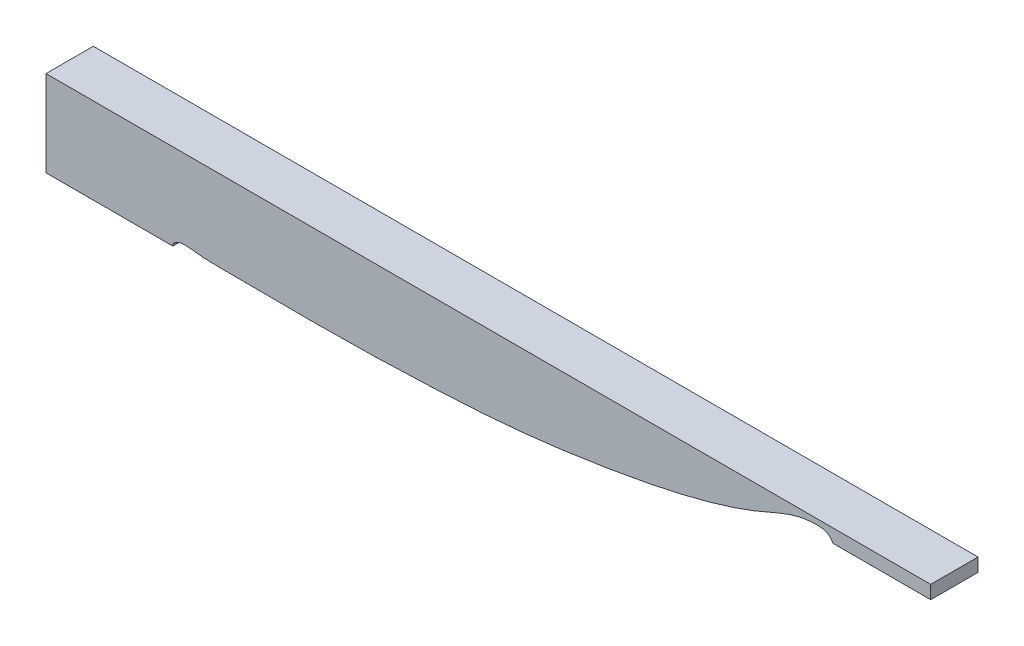
ISO-10303-21;
HEADER;
FILE_DESCRIPTION(('STEP AP214'),'2;1');
FILE_NAME('part.step','',(''),(''),'','','');
FILE_SCHEMA(('AUTOMOTIVE_DESIGN { 1 0 10303 214 1 1 1 1 }'));
ENDSEC;
DATA;
#1=APPLICATION_CONTEXT('core data for automotive mechanical design processes');
#2=APPLICATION_PROTOCOL_DEFINITION('international standard','automotive_design',2000,#1);
#3=PRODUCT_CONTEXT('',#1,'mechanical');
#4=PRODUCT('Part','Part','',(#3));
#5=PRODUCT_RELATED_PRODUCT_CATEGORY('part','',(#4));
#6=PRODUCT_DEFINITION_FORMATION('','',#4);
#7=PRODUCT_DEFINITION_CONTEXT('part definition',#1,'design');
#8=PRODUCT_DEFINITION('design','',#6,#7);
#9=PRODUCT_DEFINITION_SHAPE('','',#8);
#10=(LENGTH_UNIT() NAMED_UNIT(*) SI_UNIT(.MILLI.,.METRE.));
#11=(NAMED_UNIT(*) PLANE_ANGLE_UNIT() SI_UNIT($,.RADIAN.));
#12=(NAMED_UNIT(*) SI_UNIT($,.STERADIAN.) SOLID_ANGLE_UNIT());
#13=UNCERTAINTY_MEASURE_WITH_UNIT(LENGTH_MEASURE(1.E-05),#10,'distance_accuracy_value','');
#14=(GEOMETRIC_REPRESENTATION_CONTEXT(3) GLOBAL_UNCERTAINTY_ASSIGNED_CONTEXT((#13)) GLOBAL_UNIT_ASSIGNED_CONTEXT((#10,
#11,#12)) REPRESENTATION_CONTEXT('',''));
#15=CARTESIAN_POINT('',(0.,0.,0.));
#16=DIRECTION('',(0.,0.,1.));
#17=DIRECTION('',(1.,0.,0.));
#18=AXIS2_PLACEMENT_3D('',#15,#16,#17);
#19=CARTESIAN_POINT('',(-62.7052484087813,-12.2840293904148,452.));
#20=CARTESIAN_POINT('',(-62.7121738590316,-12.2096303217744,452.));
#21=CARTESIAN_POINT('',(-62.7180514623524,-12.134164171952,452.));
#22=CARTESIAN_POINT('',(-62.699155143721,-11.9850711025203,452.));
#23=CARTESIAN_POINT('',(-62.6742630979262,-11.9122310487829,452.));
#24=CARTESIAN_POINT('',(-62.5955876394054,-11.7852802616555,452.));
#25=CARTESIAN_POINT('',(-62.5393164774228,-11.7328335104575,452.));
#26=CARTESIAN_POINT('',(-62.4175833187329,-11.645073332359,452.));
#27=CARTESIAN_POINT('',(-62.3536428521394,-11.6049816391227,452.));
#28=CARTESIAN_POINT('',(-62.1636796681233,-11.4831247408542,452.));
#29=CARTESIAN_POINT('',(-62.0331228803665,-11.4072944019221,452.));
#30=CARTESIAN_POINT('',(-61.7632257846357,-11.2765245294321,452.));
#31=CARTESIAN_POINT('',(-61.6213141505206,-11.2232252966794,452.));
#32=CARTESIAN_POINT('',(-61.1856297690964,-11.1129358942114,452.));
#33=CARTESIAN_POINT('',(-60.8905922439576,-11.0972740294809,452.));
#34=CARTESIAN_POINT('',(-60.297250650261,-11.1072088487196,452.));
#35=CARTESIAN_POINT('',(-59.999439103481,-11.1326509879397,452.));
#36=CARTESIAN_POINT('',(-59.407480124833,-11.1971270396552,452.));
#37=CARTESIAN_POINT('',(-59.1121988801194,-11.2363530762913,452.));
#38=CARTESIAN_POINT('',(-58.5204096285446,-11.3025277513826,452.));
#39=CARTESIAN_POINT('',(-58.2239689937358,-11.3301506472831,452.));
#40=CARTESIAN_POINT('',(-57.3332517410831,-11.3990547324693,452.));
#41=CARTESIAN_POINT('',(-56.7388339925977,-11.4256387706635,452.));
#42=CARTESIAN_POINT('',(-55.5497412734209,-11.4561396280096,452.));
#43=CARTESIAN_POINT('',(-54.9550206700727,-11.4628491862308,452.));
#44=CARTESIAN_POINT('',(-53.765569067012,-11.47575870622,452.));
#45=CARTESIAN_POINT('',(-53.1708478344687,-11.4824374233119,452.));
#46=CARTESIAN_POINT('',(-51.3866148993883,-11.4990797767451,452.));
#47=CARTESIAN_POINT('',(-50.1970311958799,-11.505735180364,452.));
#48=CARTESIAN_POINT('',(-46.6283315797209,-11.5240833752778,452.));
#49=CARTESIAN_POINT('',(-44.2491742097644,-11.5328653690821,452.));
#50=CARTESIAN_POINT('',(-39.4908495052337,-11.5367494061676,452.));
#51=CARTESIAN_POINT('',(-37.1116877219363,-11.5297156373008,452.));
#52=CARTESIAN_POINT('',(-32.3537154297238,-11.4772555912144,452.));
#53=CARTESIAN_POINT('',(-29.9749126769411,-11.4330188772853,452.));
#54=CARTESIAN_POINT('',(-25.2188871638521,-11.3031881700815,452.));
#55=CARTESIAN_POINT('',(-22.8415086655277,-11.2180343466114,452.));
#56=CARTESIAN_POINT('',(-18.0876675883811,-11.0185007335615,452.));
#57=CARTESIAN_POINT('',(-15.7112451034112,-10.9029825213608,452.));
#58=CARTESIAN_POINT('',(-10.9621356269786,-10.6234025116616,452.));
#59=CARTESIAN_POINT('',(-8.58935175775453,-10.4577567002171,452.));
#60=CARTESIAN_POINT('',(-3.84950926087558,-10.0428729316787,452.));
#61=CARTESIAN_POINT('',(-1.48262718248254,-9.79290226620141,452.));
#62=CARTESIAN_POINT('',(3.23810622948647,-9.20853810090821,452.));
#63=CARTESIAN_POINT('',(5.59327830851287,-8.87736682813762,452.));
#64=CARTESIAN_POINT('',(10.2955973372614,-8.15479025718168,452.));
#65=CARTESIAN_POINT('',(12.6428112063497,-7.76312125925916,452.));
#66=CARTESIAN_POINT('',(17.3230454894747,-6.90573778166401,452.));
#67=CARTESIAN_POINT('',(19.6571732150893,-6.44213138906897,452.));
#68=CARTESIAN_POINT('',(23.139396543935,-5.6632435976321,452.));
#69=CARTESIAN_POINT('',(24.2975429745054,-5.38869095537908,452.));
#70=CARTESIAN_POINT('',(26.6020790891636,-4.80154569492244,452.));
#71=CARTESIAN_POINT('',(27.7478909570069,-4.48848341746983,452.));
#72=CARTESIAN_POINT('',(31.1668493131534,-3.49351832241277,452.));
#73=CARTESIAN_POINT('',(33.4237405593667,-2.762544929267,452.));
#74=CARTESIAN_POINT('',(36.1848610801607,-1.66772246380116,452.));
#75=CARTESIAN_POINT('',(36.734137794449,-1.43986052602558,452.));
#76=CARTESIAN_POINT('',(37.829418084322,-0.974255850230333,452.));
#77=CARTESIAN_POINT('',(38.3749180741802,-0.734971473130707,452.));
#78=CARTESIAN_POINT('',(40.014283241704,-0.025918390729653,452.));
#79=CARTESIAN_POINT('',(41.1119333530073,0.432109591118433,452.));
#80=CARTESIAN_POINT('',(42.8198911289569,0.928813933071767,452.));
#81=CARTESIAN_POINT('',(43.3998454899815,1.06145793692773,452.));
#82=CARTESIAN_POINT('',(44.5815780106277,1.25918391062123,452.));
#83=CARTESIAN_POINT('',(45.1823164747849,1.32549328918058,452.));
#84=CARTESIAN_POINT('',(46.0795814668789,1.35833804015265,452.));
#85=CARTESIAN_POINT('',(46.3788638651951,1.35855045926507,452.));
#86=CARTESIAN_POINT('',(46.8283960941802,1.32519955959442,452.));
#87=CARTESIAN_POINT('',(46.9783372345549,1.30871300470868,452.));
#88=CARTESIAN_POINT('',(47.2784604887634,1.26240923004741,452.));
#89=CARTESIAN_POINT('',(47.426687102723,1.23229191641705,452.));
#90=CARTESIAN_POINT('',(47.7159595327065,1.14737796162339,452.));
#91=CARTESIAN_POINT('',(47.8592174930012,1.09090343219004,452.));
#92=CARTESIAN_POINT('',(48.1205666503784,0.93828347895032,452.));
#93=CARTESIAN_POINT('',(48.2353877427949,0.840295544021604,452.));
#94=CARTESIAN_POINT('',(48.4471040786393,0.621035341205771,452.));
#95=CARTESIAN_POINT('',(48.5410776992265,0.501535423135573,452.));
#96=CARTESIAN_POINT('',(48.6879173212099,0.327168065883125,452.));
#97=CARTESIAN_POINT('',(48.7371148095842,0.269254019208788,452.));
#98=CARTESIAN_POINT('',(48.8242175901574,0.144048041888548,452.));
#99=CARTESIAN_POINT('',(48.8596456390957,0.0758553950526798,452.));
#100=CARTESIAN_POINT('',(48.8731439710612,1.12228477379406E-13,452.));
#101=B_SPLINE_CURVE_WITH_KNOTS('',3,(#19,#20,#21,#22,#23,#24,#25,#26,#27,#28,#29,#30,#31,#32,
#33,#34,#35,#36,#37,#38,#39,#40,#41,#42,#43,#44,#45,#46,#47,#48,#49,#50,#51,#52,#53,#54,#55,#56,
#57,#58,#59,#60,#61,#62,#63,#64,#65,#66,#67,#68,#69,#70,#71,#72,#73,#74,#75,#76,#77,#78,#79,#80,
#81,#82,#83,#84,#85,#86,#87,#88,#89,#90,#91,#92,#93,#94,#95,#96,#97,#98,#99,#100),.UNSPECIFIED.,
.F.,.F.,(4,2,2,2,2,2,2,2,2,2,2,2,2,2,2,2,2,2,2,2,2,2,2,2,2,2,2,2,2,2,2,2,2,2,2,2,2,2,2,2,4),(0.,
0.001953125,0.00390625000000011,0.00585937500000011,0.00781250000000011,0.0117187500000002,
0.0156250000000003,0.0234375000000003,0.0312500000000004,0.0390625000000004,0.0468750000000006,
0.0625000000000006,0.0781250000000006,0.0937500000000006,0.125,0.1875,0.25,0.3125,0.375,0.4375,
0.5,0.5625,0.625,0.6875,0.75,0.78125,0.8125,0.875,0.890625,0.90625,0.9375,0.953125,0.96875,
0.9765625,0.98046875,0.984375,0.98828125,0.9921875,0.99609375,0.998046875,1.),.UNSPECIFIED.);
#102=DIRECTION('',(0.,0.,-1.));
#103=VECTOR('',#102,1.);
#104=SURFACE_OF_LINEAR_EXTRUSION('',#101,#103);
#105=CARTESIAN_POINT('',(-62.7052484087813,-12.2840293904148,444.));
#106=CARTESIAN_POINT('',(-62.7121738590316,-12.2096303217744,444.));
#107=CARTESIAN_POINT('',(-62.7180514623524,-12.134164171952,444.));
#108=CARTESIAN_POINT('',(-62.699155143721,-11.9850711025203,444.));
#109=CARTESIAN_POINT('',(-62.6742630979262,-11.9122310487829,444.));
#110=CARTESIAN_POINT('',(-62.5955876394054,-11.7852802616555,444.));
#111=CARTESIAN_POINT('',(-62.5393164774228,-11.7328335104575,444.));
#112=CARTESIAN_POINT('',(-62.4175833187329,-11.645073332359,444.));
#113=CARTESIAN_POINT('',(-62.3536428521394,-11.6049816391227,444.));
#114=CARTESIAN_POINT('',(-62.1636796681233,-11.4831247408542,444.));
#115=CARTESIAN_POINT('',(-62.0331228803665,-11.4072944019221,444.));
#116=CARTESIAN_POINT('',(-61.7632257846357,-11.2765245294321,444.));
#117=CARTESIAN_POINT('',(-61.6213141505206,-11.2232252966794,444.));
#118=CARTESIAN_POINT('',(-61.1856297690964,-11.1129358942114,444.));
#119=CARTESIAN_POINT('',(-60.8905922439576,-11.0972740294809,444.));
#120=CARTESIAN_POINT('',(-60.297250650261,-11.1072088487196,444.));
#121=CARTESIAN_POINT('',(-59.999439103481,-11.1326509879397,444.));
#122=CARTESIAN_POINT('',(-59.407480124833,-11.1971270396552,444.));
#123=CARTESIAN_POINT('',(-59.1121988801194,-11.2363530762913,444.));
#124=CARTESIAN_POINT('',(-58.5204096285446,-11.3025277513826,444.));
#125=CARTESIAN_POINT('',(-58.2239689937358,-11.3301506472831,444.));
#126=CARTESIAN_POINT('',(-57.3332517410831,-11.3990547324693,444.));
#127=CARTESIAN_POINT('',(-56.7388339925977,-11.4256387706635,444.));
#128=CARTESIAN_POINT('',(-55.5497412734209,-11.4561396280096,444.));
#129=CARTESIAN_POINT('',(-54.9550206700727,-11.4628491862308,444.));
#130=CARTESIAN_POINT('',(-53.765569067012,-11.47575870622,444.));
#131=CARTESIAN_POINT('',(-53.1708478344687,-11.4824374233119,444.));
#132=CARTESIAN_POINT('',(-51.3866148993883,-11.4990797767451,444.));
#133=CARTESIAN_POINT('',(-50.1970311958799,-11.505735180364,444.));
#134=CARTESIAN_POINT('',(-46.6283315797209,-11.5240833752778,444.));
#135=CARTESIAN_POINT('',(-44.2491742097644,-11.5328653690821,444.));
#136=CARTESIAN_POINT('',(-39.4908495052337,-11.5367494061676,444.));
#137=CARTESIAN_POINT('',(-37.1116877219363,-11.5297156373008,444.));
#138=CARTESIAN_POINT('',(-32.3537154297238,-11.4772555912144,444.));
#139=CARTESIAN_POINT('',(-29.9749126769411,-11.4330188772853,444.));
#140=CARTESIAN_POINT('',(-25.2188871638521,-11.3031881700815,444.));
#141=CARTESIAN_POINT('',(-22.8415086655277,-11.2180343466114,444.));
#142=CARTESIAN_POINT('',(-18.0876675883811,-11.0185007335615,444.));
#143=CARTESIAN_POINT('',(-15.7112451034112,-10.9029825213608,444.));
#144=CARTESIAN_POINT('',(-10.9621356269786,-10.6234025116616,444.));
#145=CARTESIAN_POINT('',(-8.58935175775453,-10.4577567002171,444.));
#146=CARTESIAN_POINT('',(-3.84950926087558,-10.0428729316787,444.));
#147=CARTESIAN_POINT('',(-1.48262718248254,-9.79290226620141,444.));
#148=CARTESIAN_POINT('',(3.23810622948647,-9.20853810090821,444.));
#149=CARTESIAN_POINT('',(5.59327830851287,-8.87736682813762,444.));
#150=CARTESIAN_POINT('',(10.2955973372614,-8.15479025718168,444.));
#151=CARTESIAN_POINT('',(12.6428112063497,-7.76312125925916,444.));
#152=CARTESIAN_POINT('',(17.3230454894747,-6.90573778166401,444.));
#153=CARTESIAN_POINT('',(19.6571732150893,-6.44213138906897,444.));
#154=CARTESIAN_POINT('',(23.139396543935,-5.6632435976321,444.));
#155=CARTESIAN_POINT('',(24.2975429745054,-5.38869095537908,444.));
#156=CARTESIAN_POINT('',(26.6020790891636,-4.80154569492244,444.));
#157=CARTESIAN_POINT('',(27.7478909570069,-4.48848341746983,444.));
#158=CARTESIAN_POINT('',(31.1668493131534,-3.49351832241277,444.));
#159=CARTESIAN_POINT('',(33.4237405593667,-2.762544929267,444.));
#160=CARTESIAN_POINT('',(36.1848610801607,-1.66772246380116,444.));
#161=CARTESIAN_POINT('',(36.734137794449,-1.43986052602558,444.));
#162=CARTESIAN_POINT('',(37.829418084322,-0.974255850230333,444.));
#163=CARTESIAN_POINT('',(38.3749180741802,-0.734971473130707,444.));
#164=CARTESIAN_POINT('',(40.014283241704,-0.025918390729653,444.));
#165=CARTESIAN_POINT('',(41.1119333530073,0.432109591118433,444.));
#166=CARTESIAN_POINT('',(42.8198911289569,0.928813933071767,444.));
#167=CARTESIAN_POINT('',(43.3998454899815,1.06145793692773,444.));
#168=CARTESIAN_POINT('',(44.5815780106277,1.25918391062123,444.));
#169=CARTESIAN_POINT('',(45.1823164747849,1.32549328918058,444.));
#170=CARTESIAN_POINT('',(46.0795814668789,1.35833804015265,444.));
#171=CARTESIAN_POINT('',(46.3788638651951,1.35855045926507,444.));
#172=CARTESIAN_POINT('',(46.8283960941802,1.32519955959442,444.));
#173=CARTESIAN_POINT('',(46.9783372345549,1.30871300470868,444.));
#174=CARTESIAN_POINT('',(47.2784604887634,1.26240923004741,444.));
#175=CARTESIAN_POINT('',(47.426687102723,1.23229191641705,444.));
#176=CARTESIAN_POINT('',(47.7159595327065,1.14737796162339,444.));
#177=CARTESIAN_POINT('',(47.8592174930012,1.09090343219004,444.));
#178=CARTESIAN_POINT('',(48.1205666503784,0.93828347895032,444.));
#179=CARTESIAN_POINT('',(48.2353877427949,0.840295544021604,444.));
#180=CARTESIAN_POINT('',(48.4471040786393,0.621035341205771,444.));
#181=CARTESIAN_POINT('',(48.5410776992265,0.501535423135573,444.));
#182=CARTESIAN_POINT('',(48.6879173212099,0.327168065883125,444.));
#183=CARTESIAN_POINT('',(48.7371148095842,0.269254019208788,444.));
#184=CARTESIAN_POINT('',(48.8242175901574,0.144048041888548,444.));
#185=CARTESIAN_POINT('',(48.8596456390957,0.0758553950526798,444.));
#186=CARTESIAN_POINT('',(48.8731439710612,1.12228477379406E-13,444.));
#187=B_SPLINE_CURVE_WITH_KNOTS('',3,(#105,#106,#107,#108,#109,#110,#111,#112,#113,#114,#115,
#116,#117,#118,#119,#120,#121,#122,#123,#124,#125,#126,#127,#128,#129,#130,#131,#132,#133,#134,
#135,#136,#137,#138,#139,#140,#141,#142,#143,#144,#145,#146,#147,#148,#149,#150,#151,#152,#153,
#154,#155,#156,#157,#158,#159,#160,#161,#162,#163,#164,#165,#166,#167,#168,#169,#170,#171,#172,
#173,#174,#175,#176,#177,#178,#179,#180,#181,#182,#183,#184,#185,#186),.UNSPECIFIED.,.F.,.F.,(4,
2,2,2,2,2,2,2,2,2,2,2,2,2,2,2,2,2,2,2,2,2,2,2,2,2,2,2,2,2,2,2,2,2,2,2,2,2,2,2,4),(0.,
0.001953125,0.00390625000000011,0.00585937500000011,0.00781250000000011,0.0117187500000002,
0.0156250000000003,0.0234375000000003,0.0312500000000004,0.0390625000000004,0.0468750000000006,
0.0625000000000006,0.0781250000000006,0.0937500000000006,0.125,0.1875,0.25,0.3125,0.375,0.4375,
0.5,0.5625,0.625,0.6875,0.75,0.78125,0.8125,0.875,0.890625,0.90625,0.9375,0.953125,0.96875,
0.9765625,0.98046875,0.984375,0.98828125,0.9921875,0.99609375,0.998046875,1.),.UNSPECIFIED.);
#188=CARTESIAN_POINT('',(-62.7052484087867,-12.2840293904152,444.));
#189=VERTEX_POINT('',#188);
#190=CARTESIAN_POINT('',(48.8731439710573,0.,444.));
#191=VERTEX_POINT('',#190);
#192=EDGE_CURVE('E165',#189,#191,#187,.T.);
#193=ORIENTED_EDGE('',*,*,#192,.T.);
#194=DIRECTION('',(0.,0.,-1.));
#195=VECTOR('',#194,1.);
#196=CARTESIAN_POINT('',(48.8731439710573,0.,452.));
#197=LINE('',#196,#195);
#198=CARTESIAN_POINT('',(48.8731439710573,0.,452.));
#199=VERTEX_POINT('',#198);
#200=EDGE_CURVE('E11',#199,#191,#197,.T.);
#201=ORIENTED_EDGE('',*,*,#200,.F.);
#202=CARTESIAN_POINT('',(48.8731439710612,1.12228477379406E-13,452.));
#203=CARTESIAN_POINT('',(48.8596456390957,0.0758553950526798,452.));
#204=CARTESIAN_POINT('',(48.8242175901574,0.144048041888548,452.));
#205=CARTESIAN_POINT('',(48.7371148095842,0.269254019208788,452.));
#206=CARTESIAN_POINT('',(48.6879173212099,0.327168065883125,452.));
#207=CARTESIAN_POINT('',(48.5410776992265,0.501535423135573,452.));
#208=CARTESIAN_POINT('',(48.4471040786393,0.621035341205771,452.));
#209=CARTESIAN_POINT('',(48.2353877427949,0.840295544021604,452.));
#210=CARTESIAN_POINT('',(48.1205666503784,0.93828347895032,452.));
#211=CARTESIAN_POINT('',(47.8592174930012,1.09090343219004,452.));
#212=CARTESIAN_POINT('',(47.7159595327065,1.14737796162339,452.));
#213=CARTESIAN_POINT('',(47.426687102723,1.23229191641705,452.));
#214=CARTESIAN_POINT('',(47.2784604887634,1.26240923004741,452.));
#215=CARTESIAN_POINT('',(46.9783372345549,1.30871300470868,452.));
#216=CARTESIAN_POINT('',(46.8283960941802,1.32519955959442,452.));
#217=CARTESIAN_POINT('',(46.3788638651951,1.35855045926507,452.));
#218=CARTESIAN_POINT('',(46.0795814668789,1.35833804015265,452.));
#219=CARTESIAN_POINT('',(45.1823164747849,1.32549328918058,452.));
#220=CARTESIAN_POINT('',(44.5815780106277,1.25918391062123,452.));
#221=CARTESIAN_POINT('',(43.3998454899815,1.06145793692773,452.));
#222=CARTESIAN_POINT('',(42.8198911289569,0.928813933071767,452.));
#223=CARTESIAN_POINT('',(41.1119333530073,0.432109591118433,452.));
#224=CARTESIAN_POINT('',(40.014283241704,-0.025918390729653,452.));
#225=CARTESIAN_POINT('',(38.3749180741802,-0.734971473130707,452.));
#226=CARTESIAN_POINT('',(37.829418084322,-0.974255850230333,452.));
#227=CARTESIAN_POINT('',(36.734137794449,-1.43986052602558,452.));
#228=CARTESIAN_POINT('',(36.1848610801607,-1.66772246380116,452.));
#229=CARTESIAN_POINT('',(33.4237405593667,-2.762544929267,452.));
#230=CARTESIAN_POINT('',(31.1668493131534,-3.49351832241277,452.));
#231=CARTESIAN_POINT('',(27.7478909570069,-4.48848341746983,452.));
#232=CARTESIAN_POINT('',(26.6020790891636,-4.80154569492244,452.));
#233=CARTESIAN_POINT('',(24.2975429745054,-5.38869095537908,452.));
#234=CARTESIAN_POINT('',(23.139396543935,-5.6632435976321,452.));
#235=CARTESIAN_POINT('',(19.6571732150893,-6.44213138906897,452.));
#236=CARTESIAN_POINT('',(17.3230454894747,-6.90573778166401,452.));
#237=CARTESIAN_POINT('',(12.6428112063497,-7.76312125925916,452.));
#238=CARTESIAN_POINT('',(10.2955973372614,-8.15479025718168,452.));
#239=CARTESIAN_POINT('',(5.59327830851287,-8.87736682813762,452.));
#240=CARTESIAN_POINT('',(3.23810622948647,-9.20853810090821,452.));
#241=CARTESIAN_POINT('',(-1.48262718248254,-9.79290226620141,452.));
#242=CARTESIAN_POINT('',(-3.84950926087558,-10.0428729316787,452.));
#243=CARTESIAN_POINT('',(-8.58935175775453,-10.4577567002171,452.));
#244=CARTESIAN_POINT('',(-10.9621356269786,-10.6234025116616,452.));
#245=CARTESIAN_POINT('',(-15.7112451034112,-10.9029825213608,452.));
#246=CARTESIAN_POINT('',(-18.0876675883811,-11.0185007335615,452.));
#247=CARTESIAN_POINT('',(-22.8415086655277,-11.2180343466114,452.));
#248=CARTESIAN_POINT('',(-25.2188871638521,-11.3031881700815,452.));
#249=CARTESIAN_POINT('',(-29.9749126769411,-11.4330188772853,452.));
#250=CARTESIAN_POINT('',(-32.3537154297238,-11.4772555912144,452.));
#251=CARTESIAN_POINT('',(-37.1116877219363,-11.5297156373008,452.));
#252=CARTESIAN_POINT('',(-39.4908495052337,-11.5367494061676,452.));
#253=CARTESIAN_POINT('',(-44.2491742097644,-11.5328653690821,452.));
#254=CARTESIAN_POINT('',(-46.6283315797209,-11.5240833752778,452.));
#255=CARTESIAN_POINT('',(-50.1970311958799,-11.505735180364,452.));
#256=CARTESIAN_POINT('',(-51.3866148993883,-11.4990797767451,452.));
#257=CARTESIAN_POINT('',(-53.1708478344687,-11.4824374233119,452.));
#258=CARTESIAN_POINT('',(-53.765569067012,-11.47575870622,452.));
#259=CARTESIAN_POINT('',(-54.9550206700727,-11.4628491862308,452.));
#260=CARTESIAN_POINT('',(-55.5497412734209,-11.4561396280096,452.));
#261=CARTESIAN_POINT('',(-56.7388339925977,-11.4256387706635,452.));
#262=CARTESIAN_POINT('',(-57.3332517410831,-11.3990547324693,452.));
#263=CARTESIAN_POINT('',(-58.2239689937358,-11.3301506472831,452.));
#264=CARTESIAN_POINT('',(-58.5204096285446,-11.3025277513826,452.));
#265=CARTESIAN_POINT('',(-59.1121988801194,-11.2363530762913,452.));
#266=CARTESIAN_POINT('',(-59.407480124833,-11.1971270396552,452.));
#267=CARTESIAN_POINT('',(-59.999439103481,-11.1326509879397,452.));
#268=CARTESIAN_POINT('',(-60.297250650261,-11.1072088487196,452.));
#269=CARTESIAN_POINT('',(-60.8905922439576,-11.0972740294809,452.));
#270=CARTESIAN_POINT('',(-61.1856297690964,-11.1129358942114,452.));
#271=CARTESIAN_POINT('',(-61.6213141505206,-11.2232252966794,452.));
#272=CARTESIAN_POINT('',(-61.7632257846357,-11.2765245294321,452.));
#273=CARTESIAN_POINT('',(-62.0331228803665,-11.4072944019221,452.));
#274=CARTESIAN_POINT('',(-62.1636796681233,-11.4831247408542,452.));
#275=CARTESIAN_POINT('',(-62.3536428521394,-11.6049816391227,452.));
#276=CARTESIAN_POINT('',(-62.4175833187329,-11.645073332359,452.));
#277=CARTESIAN_POINT('',(-62.5393164774228,-11.7328335104575,452.));
#278=CARTESIAN_POINT('',(-62.5955876394054,-11.7852802616555,452.));
#279=CARTESIAN_POINT('',(-62.6742630979262,-11.9122310487829,452.));
#280=CARTESIAN_POINT('',(-62.699155143721,-11.9850711025203,452.));
#281=CARTESIAN_POINT('',(-62.7180514623524,-12.134164171952,452.));
#282=CARTESIAN_POINT('',(-62.7121738590316,-12.2096303217744,452.));
#283=CARTESIAN_POINT('',(-62.7052484087813,-12.2840293904148,452.));
#284=B_SPLINE_CURVE_WITH_KNOTS('',3,(#202,#203,#204,#205,#206,#207,#208,#209,#210,#211,#212,
#213,#214,#215,#216,#217,#218,#219,#220,#221,#222,#223,#224,#225,#226,#227,#228,#229,#230,#231,
#232,#233,#234,#235,#236,#237,#238,#239,#240,#241,#242,#243,#244,#245,#246,#247,#248,#249,#250,
#251,#252,#253,#254,#255,#256,#257,#258,#259,#260,#261,#262,#263,#264,#265,#266,#267,#268,#269,
#270,#271,#272,#273,#274,#275,#276,#277,#278,#279,#280,#281,#282,#283),.UNSPECIFIED.,.F.,.F.,(4,
2,2,2,2,2,2,2,2,2,2,2,2,2,2,2,2,2,2,2,2,2,2,2,2,2,2,2,2,2,2,2,2,2,2,2,2,2,2,2,4),(0.,
0.001953125,0.00390625000000011,0.0078125,0.01171875,0.015625,0.01953125,0.0234374999999999,
0.03125,0.0468750000000001,0.0625000000000001,0.09375,0.109375,0.125,0.1875,0.21875,0.25,0.3125,
0.375,0.4375,0.5,0.5625,0.625,0.6875,0.75,0.8125,0.875,0.906249999999999,0.921874999999999,
0.937499999999999,0.953124999999999,0.9609375,0.96875,0.9765625,0.984375,0.98828125,0.9921875,
0.994140625,0.99609375,0.998046875,1.),.UNSPECIFIED.);
#285=CARTESIAN_POINT('',(-62.7052484087867,-12.2840293904152,452.));
#286=VERTEX_POINT('',#285);
#287=EDGE_CURVE('E129',#286,#199,#284,.F.);
#288=ORIENTED_EDGE('',*,*,#287,.F.);
#289=DIRECTION('',(0.,0.,-1.));
#290=VECTOR('',#289,1.);
#291=CARTESIAN_POINT('',(-62.7052484087867,-12.2840293904152,452.));
#292=LINE('',#291,#290);
#293=EDGE_CURVE('E114',#286,#189,#292,.T.);
#294=ORIENTED_EDGE('',*,*,#293,.T.);
#295=EDGE_LOOP('',(#193,#201,#288,#294));
#296=FACE_BOUND('',#295,.T.);
#297=ADVANCED_FACE('F30',(#296),#104,.F.);
#298=CARTESIAN_POINT('',(48.8731439710573,0.,452.));
#299=DIRECTION('',(0.,1.,0.));
#300=DIRECTION('',(-1.,0.,0.));
#301=AXIS2_PLACEMENT_3D('',#298,#299,#300);
#302=PLANE('',#301);
#303=DIRECTION('',(1.,0.,0.));
#304=VECTOR('',#303,1.);
#305=CARTESIAN_POINT('',(48.8731439710573,0.,444.));
#306=LINE('',#305,#304);
#307=CARTESIAN_POINT('',(65.4394393530565,0.,444.));
#308=VERTEX_POINT('',#307);
#309=EDGE_CURVE('E120',#191,#308,#306,.T.);
#310=ORIENTED_EDGE('',*,*,#309,.T.);
#311=DIRECTION('',(0.,0.,-1.));
#312=VECTOR('',#311,1.);
#313=CARTESIAN_POINT('',(65.4394393530565,0.,452.));
#314=LINE('',#313,#312);
#315=CARTESIAN_POINT('',(65.4394393530565,0.,452.));
#316=VERTEX_POINT('',#315);
#317=EDGE_CURVE('E41',#316,#308,#314,.T.);
#318=ORIENTED_EDGE('',*,*,#317,.F.);
#319=DIRECTION('',(1.,0.,0.));
#320=VECTOR('',#319,1.);
#321=CARTESIAN_POINT('',(48.8731439710573,0.,452.));
#322=LINE('',#321,#320);
#323=EDGE_CURVE('E87',#199,#316,#322,.T.);
#324=ORIENTED_EDGE('',*,*,#323,.F.);
#325=ORIENTED_EDGE('',*,*,#200,.T.);
#326=EDGE_LOOP('',(#310,#318,#324,#325));
#327=FACE_BOUND('',#326,.T.);
#328=ADVANCED_FACE('F199',(#327),#302,.F.);
#329=CARTESIAN_POINT('',(65.4394393530565,2.25600000000005,452.));
#330=DIRECTION('',(-1.,0.,0.));
#331=DIRECTION('',(0.,0.,1.));
#332=AXIS2_PLACEMENT_3D('',#329,#330,#331);
#333=PLANE('',#332);
#334=DIRECTION('',(0.,1.,0.));
#335=VECTOR('',#334,1.);
#336=CARTESIAN_POINT('',(65.4394393530565,2.25600000000005,444.));
#337=LINE('',#336,#335);
#338=CARTESIAN_POINT('',(65.4394393530565,2.25600000000005,444.));
#339=VERTEX_POINT('',#338);
#340=EDGE_CURVE('E118',#308,#339,#337,.T.);
#341=ORIENTED_EDGE('',*,*,#340,.T.);
#342=DIRECTION('',(0.,0.,-1.));
#343=VECTOR('',#342,1.);
#344=CARTESIAN_POINT('',(65.4394393530565,2.25600000000005,452.));
#345=LINE('',#344,#343);
#346=CARTESIAN_POINT('',(65.4394393530565,2.25600000000005,452.));
#347=VERTEX_POINT('',#346);
#348=EDGE_CURVE('E109',#347,#339,#345,.T.);
#349=ORIENTED_EDGE('',*,*,#348,.F.);
#350=DIRECTION('',(0.,1.,0.));
#351=VECTOR('',#350,1.);
#352=CARTESIAN_POINT('',(65.4394393530565,2.25600000000005,452.));
#353=LINE('',#352,#351);
#354=EDGE_CURVE('E100',#316,#347,#353,.T.);
#355=ORIENTED_EDGE('',*,*,#354,.F.);
#356=ORIENTED_EDGE('',*,*,#317,.T.);
#357=EDGE_LOOP('',(#341,#349,#355,#356));
#358=FACE_BOUND('',#357,.T.);
#359=ADVANCED_FACE('F202',(#358),#333,.F.);
#360=CARTESIAN_POINT('',(65.4394393530565,2.25600000000005,452.));
#361=DIRECTION('',(0.,-1.,0.));
#362=DIRECTION('',(1.,0.,0.));
#363=AXIS2_PLACEMENT_3D('',#360,#361,#362);
#364=PLANE('',#363);
#365=DIRECTION('',(-1.,0.,0.));
#366=VECTOR('',#365,1.);
#367=CARTESIAN_POINT('',(65.4394393530565,2.25600000000005,444.));
#368=LINE('',#367,#366);
#369=CARTESIAN_POINT('',(-84.1550637476835,2.25600000000003,444.));
#370=VERTEX_POINT('',#369);
#371=EDGE_CURVE('E108',#339,#370,#368,.T.);
#372=ORIENTED_EDGE('',*,*,#371,.T.);
#373=DIRECTION('',(0.,0.,-1.));
#374=VECTOR('',#373,1.);
#375=CARTESIAN_POINT('',(-84.1550637476835,2.25600000000003,452.));
#376=LINE('',#375,#374);
#377=CARTESIAN_POINT('',(-84.1550637476835,2.25600000000003,452.));
#378=VERTEX_POINT('',#377);
#379=EDGE_CURVE('E105',#378,#370,#376,.T.);
#380=ORIENTED_EDGE('',*,*,#379,.F.);
#381=DIRECTION('',(-1.,0.,0.));
#382=VECTOR('',#381,1.);
#383=CARTESIAN_POINT('',(65.4394393530565,2.25600000000005,452.));
#384=LINE('',#383,#382);
#385=EDGE_CURVE('E94',#347,#378,#384,.T.);
#386=ORIENTED_EDGE('',*,*,#385,.F.);
#387=ORIENTED_EDGE('',*,*,#348,.T.);
#388=EDGE_LOOP('',(#372,#380,#386,#387));
#389=FACE_BOUND('',#388,.T.);
#390=ADVANCED_FACE('F106',(#389),#364,.F.);
#391=CARTESIAN_POINT('',(-84.1550637476834,-12.2840150782979,452.));
#392=DIRECTION('',(1.,0.,0.));
#393=DIRECTION('',(0.,1.,0.));
#394=AXIS2_PLACEMENT_3D('',#391,#392,#393);
#395=PLANE('',#394);
#396=DIRECTION('',(0.,-1.,0.));
#397=VECTOR('',#396,1.);
#398=CARTESIAN_POINT('',(-84.1550637476834,-12.2840150782979,444.));
#399=LINE('',#398,#397);
#400=CARTESIAN_POINT('',(-84.1550637476834,-12.2840150782979,444.));
#401=VERTEX_POINT('',#400);
#402=EDGE_CURVE('E73',#370,#401,#399,.T.);
#403=ORIENTED_EDGE('',*,*,#402,.T.);
#404=DIRECTION('',(0.,0.,-1.));
#405=VECTOR('',#404,1.);
#406=CARTESIAN_POINT('',(-84.1550637476834,-12.2840150782979,452.));
#407=LINE('',#406,#405);
#408=CARTESIAN_POINT('',(-84.1550637476834,-12.2840150782979,452.));
#409=VERTEX_POINT('',#408);
#410=EDGE_CURVE('E110',#409,#401,#407,.T.);
#411=ORIENTED_EDGE('',*,*,#410,.F.);
#412=DIRECTION('',(0.,-1.,0.));
#413=VECTOR('',#412,1.);
#414=CARTESIAN_POINT('',(-84.1550637476834,-12.2840150782979,452.));
#415=LINE('',#414,#413);
#416=EDGE_CURVE('E98',#378,#409,#415,.T.);
#417=ORIENTED_EDGE('',*,*,#416,.F.);
#418=ORIENTED_EDGE('',*,*,#379,.T.);
#419=EDGE_LOOP('',(#403,#411,#417,#418));
#420=FACE_BOUND('',#419,.T.);
#421=ADVANCED_FACE('F112',(#420),#395,.F.);
#422=CARTESIAN_POINT('',(-84.1550637476834,-12.2840150782979,452.));
#423=DIRECTION('',(6.67237319715477E-07,0.999999999999777,0.));
#424=DIRECTION('',(-0.999999999999777,6.67237319715477E-07,0.));
#425=AXIS2_PLACEMENT_3D('',#422,#423,#424);
#426=PLANE('',#425);
#427=DIRECTION('',(0.999999999999777,-6.67237319715476E-07,0.));
#428=VECTOR('',#427,1.);
#429=CARTESIAN_POINT('',(-84.1550637476834,-12.2840150782979,444.));
#430=LINE('',#429,#428);
#431=EDGE_CURVE('E79',#401,#189,#430,.T.);
#432=ORIENTED_EDGE('',*,*,#431,.T.);
#433=ORIENTED_EDGE('',*,*,#293,.F.);
#434=DIRECTION('',(0.999999999999777,-6.67237319715476E-07,0.));
#435=VECTOR('',#434,1.);
#436=CARTESIAN_POINT('',(-84.1550637476834,-12.2840150782979,452.));
#437=LINE('',#436,#435);
#438=EDGE_CURVE('E50',#409,#286,#437,.T.);
#439=ORIENTED_EDGE('',*,*,#438,.F.);
#440=ORIENTED_EDGE('',*,*,#410,.T.);
#441=EDGE_LOOP('',(#432,#433,#439,#440));
#442=FACE_BOUND('',#441,.T.);
#443=ADVANCED_FACE('F145',(#442),#426,.F.);
#444=CARTESIAN_POINT('',(-6.21943050931509,-10.2503148159479,452.));
#445=DIRECTION('',(0.,0.,-1.));
#446=DIRECTION('',(-1.,0.,0.));
#447=AXIS2_PLACEMENT_3D('',#444,#445,#446);
#448=PLANE('',#447);
#449=ORIENTED_EDGE('',*,*,#287,.T.);
#450=ORIENTED_EDGE('',*,*,#323,.T.);
#451=ORIENTED_EDGE('',*,*,#354,.T.);
#452=ORIENTED_EDGE('',*,*,#385,.T.);
#453=ORIENTED_EDGE('',*,*,#416,.T.);
#454=ORIENTED_EDGE('',*,*,#438,.T.);
#455=EDGE_LOOP('',(#449,#450,#451,#452,#453,#454));
#456=FACE_BOUND('',#455,.T.);
#457=ADVANCED_FACE('F96',(#456),#448,.F.);
#458=CARTESIAN_POINT('',(-6.21943050931509,-10.2503148159479,444.));
#459=DIRECTION('',(0.,0.,-1.));
#460=DIRECTION('',(-1.,0.,0.));
#461=AXIS2_PLACEMENT_3D('',#458,#459,#460);
#462=PLANE('',#461);
#463=ORIENTED_EDGE('',*,*,#192,.F.);
#464=ORIENTED_EDGE('',*,*,#431,.F.);
#465=ORIENTED_EDGE('',*,*,#402,.F.);
#466=ORIENTED_EDGE('',*,*,#371,.F.);
#467=ORIENTED_EDGE('',*,*,#340,.F.);
#468=ORIENTED_EDGE('',*,*,#309,.F.);
#469=EDGE_LOOP('',(#463,#464,#465,#466,#467,#468));
#470=FACE_BOUND('',#469,.T.);
#471=ADVANCED_FACE('F144',(#470),#462,.T.);
#472=CLOSED_SHELL('',(#297,#328,#359,#390,#421,#443,#457,#471));
#473=MANIFOLD_SOLID_BREP('B2',#472);
#474=ADVANCED_BREP_SHAPE_REPRESENTATION('',(#18,#473),#14);
#475=SHAPE_DEFINITION_REPRESENTATION(#9,#474);
ENDSEC;
END-ISO-10303-21;
